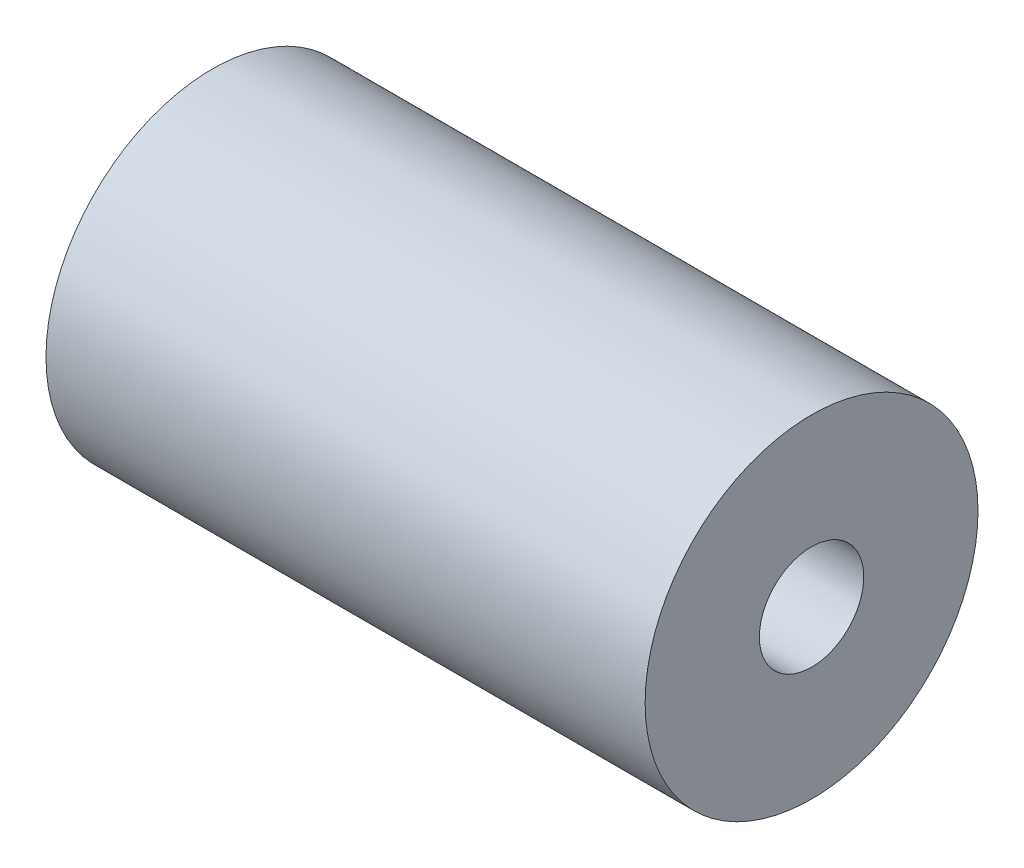
ISO-10303-21;
HEADER;
FILE_DESCRIPTION(('STEP AP214'),'2;1');
FILE_NAME('part.step','',(''),(''),'','','');
FILE_SCHEMA(('AUTOMOTIVE_DESIGN { 1 0 10303 214 1 1 1 1 }'));
ENDSEC;
DATA;
#1=APPLICATION_CONTEXT('core data for automotive mechanical design processes');
#2=APPLICATION_PROTOCOL_DEFINITION('international standard','automotive_design',2000,#1);
#3=PRODUCT_CONTEXT('',#1,'mechanical');
#4=PRODUCT('Part','Part','',(#3));
#5=PRODUCT_RELATED_PRODUCT_CATEGORY('part','',(#4));
#6=PRODUCT_DEFINITION_FORMATION('','',#4);
#7=PRODUCT_DEFINITION_CONTEXT('part definition',#1,'design');
#8=PRODUCT_DEFINITION('design','',#6,#7);
#9=PRODUCT_DEFINITION_SHAPE('','',#8);
#10=(LENGTH_UNIT() NAMED_UNIT(*) SI_UNIT(.MILLI.,.METRE.));
#11=(NAMED_UNIT(*) PLANE_ANGLE_UNIT() SI_UNIT($,.RADIAN.));
#12=(NAMED_UNIT(*) SI_UNIT($,.STERADIAN.) SOLID_ANGLE_UNIT());
#13=UNCERTAINTY_MEASURE_WITH_UNIT(LENGTH_MEASURE(1.E-05),#10,'distance_accuracy_value','');
#14=(GEOMETRIC_REPRESENTATION_CONTEXT(3) GLOBAL_UNCERTAINTY_ASSIGNED_CONTEXT((#13)) GLOBAL_UNIT_ASSIGNED_CONTEXT((#10,
#11,#12)) REPRESENTATION_CONTEXT('',''));
#15=CARTESIAN_POINT('',(0.,0.,0.));
#16=DIRECTION('',(0.,0.,1.));
#17=DIRECTION('',(1.,0.,0.));
#18=AXIS2_PLACEMENT_3D('',#15,#16,#17);
#19=CARTESIAN_POINT('',(-72.8939918967907,0.,0.));
#20=DIRECTION('',(-1.,0.,0.));
#21=DIRECTION('',(0.,0.,1.));
#22=AXIS2_PLACEMENT_3D('',#19,#20,#21);
#23=CYLINDRICAL_SURFACE('',#22,7.9375);
#24=CARTESIAN_POINT('',(-14.2875,0.,0.));
#25=DIRECTION('',(-1.,0.,0.));
#26=DIRECTION('',(0.,0.,1.));
#27=AXIS2_PLACEMENT_3D('',#24,#25,#26);
#28=CIRCLE('',#27,7.9375);
#29=CARTESIAN_POINT('',(-14.2875,0.,7.9375));
#30=VERTEX_POINT('',#29);
#31=EDGE_CURVE('E46',#30,#30,#28,.T.);
#32=ORIENTED_EDGE('',*,*,#31,.F.);
#33=EDGE_LOOP('',(#32));
#34=FACE_BOUND('',#33,.T.);
#35=CARTESIAN_POINT('',(14.2875,0.,0.));
#36=DIRECTION('',(-1.,0.,0.));
#37=DIRECTION('',(0.,0.,1.));
#38=AXIS2_PLACEMENT_3D('',#35,#36,#37);
#39=CIRCLE('',#38,7.9375);
#40=CARTESIAN_POINT('',(14.2875,0.,7.9375));
#41=VERTEX_POINT('',#40);
#42=EDGE_CURVE('E10',#41,#41,#39,.T.);
#43=ORIENTED_EDGE('',*,*,#42,.T.);
#44=EDGE_LOOP('',(#43));
#45=FACE_BOUND('',#44,.T.);
#46=ADVANCED_FACE('F32',(#34,#45),#23,.T.);
#47=CARTESIAN_POINT('',(14.2875,0.,-7.9375));
#48=DIRECTION('',(-1.,0.,0.));
#49=DIRECTION('',(0.,0.,1.));
#50=AXIS2_PLACEMENT_3D('',#47,#48,#49);
#51=PLANE('',#50);
#52=ORIENTED_EDGE('',*,*,#42,.F.);
#53=EDGE_LOOP('',(#52));
#54=FACE_BOUND('',#53,.T.);
#55=CARTESIAN_POINT('',(14.2875,0.,0.));
#56=DIRECTION('',(-1.,0.,0.));
#57=DIRECTION('',(0.,0.,1.));
#58=AXIS2_PLACEMENT_3D('',#55,#56,#57);
#59=CIRCLE('',#58,2.4892);
#60=CARTESIAN_POINT('',(14.2875,0.,2.4892));
#61=VERTEX_POINT('',#60);
#62=EDGE_CURVE('E38',#61,#61,#59,.T.);
#63=ORIENTED_EDGE('',*,*,#62,.T.);
#64=EDGE_LOOP('',(#63));
#65=FACE_BOUND('',#64,.T.);
#66=ADVANCED_FACE('F55',(#54,#65),#51,.F.);
#67=CARTESIAN_POINT('',(-72.8939918967907,0.,0.));
#68=DIRECTION('',(-1.,0.,0.));
#69=DIRECTION('',(0.,0.,1.));
#70=AXIS2_PLACEMENT_3D('',#67,#68,#69);
#71=CYLINDRICAL_SURFACE('',#70,2.4892);
#72=ORIENTED_EDGE('',*,*,#62,.F.);
#73=EDGE_LOOP('',(#72));
#74=FACE_BOUND('',#73,.T.);
#75=CARTESIAN_POINT('',(-14.2875,0.,0.));
#76=DIRECTION('',(-1.,0.,0.));
#77=DIRECTION('',(0.,0.,1.));
#78=AXIS2_PLACEMENT_3D('',#75,#76,#77);
#79=CIRCLE('',#78,2.4892);
#80=CARTESIAN_POINT('',(-14.2875,0.,2.4892));
#81=VERTEX_POINT('',#80);
#82=EDGE_CURVE('E42',#81,#81,#79,.T.);
#83=ORIENTED_EDGE('',*,*,#82,.T.);
#84=EDGE_LOOP('',(#83));
#85=FACE_BOUND('',#84,.T.);
#86=ADVANCED_FACE('F59',(#74,#85),#71,.F.);
#87=CARTESIAN_POINT('',(-14.2875,0.,-7.9375));
#88=DIRECTION('',(1.,0.,0.));
#89=DIRECTION('',(0.,0.,-1.));
#90=AXIS2_PLACEMENT_3D('',#87,#88,#89);
#91=PLANE('',#90);
#92=ORIENTED_EDGE('',*,*,#82,.F.);
#93=EDGE_LOOP('',(#92));
#94=FACE_BOUND('',#93,.T.);
#95=ORIENTED_EDGE('',*,*,#31,.T.);
#96=EDGE_LOOP('',(#95));
#97=FACE_BOUND('',#96,.T.);
#98=ADVANCED_FACE('F52',(#94,#97),#91,.F.);
#99=CLOSED_SHELL('',(#46,#66,#86,#98));
#100=MANIFOLD_SOLID_BREP('B2',#99);
#101=ADVANCED_BREP_SHAPE_REPRESENTATION('',(#18,#100),#14);
#102=SHAPE_DEFINITION_REPRESENTATION(#9,#101);
ENDSEC;
END-ISO-10303-21;
